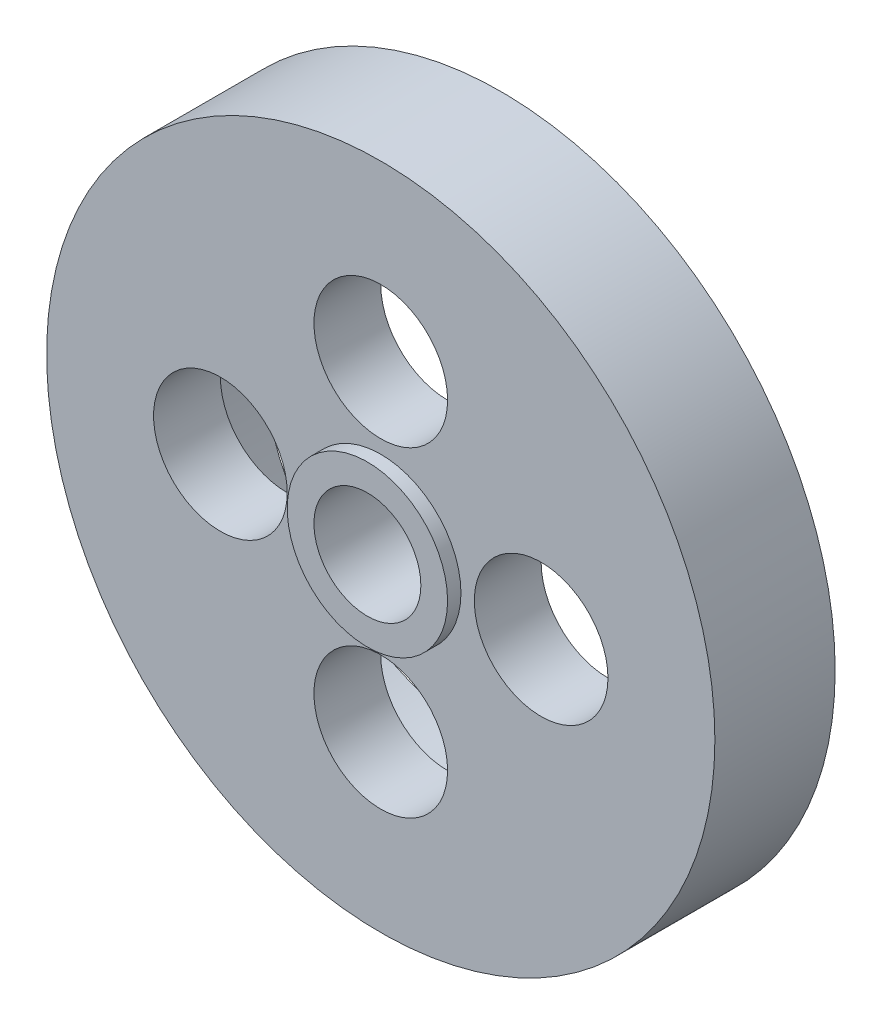
ISO-10303-21;
HEADER;
FILE_DESCRIPTION(('STEP AP214'),'2;1');
FILE_NAME('part.step','',(''),(''),'','','');
FILE_SCHEMA(('AUTOMOTIVE_DESIGN { 1 0 10303 214 1 1 1 1 }'));
ENDSEC;
DATA;
#1=APPLICATION_CONTEXT('core data for automotive mechanical design processes');
#2=APPLICATION_PROTOCOL_DEFINITION('international standard','automotive_design',2000,#1);
#3=PRODUCT_CONTEXT('',#1,'mechanical');
#4=PRODUCT('Part','Part','',(#3));
#5=PRODUCT_RELATED_PRODUCT_CATEGORY('part','',(#4));
#6=PRODUCT_DEFINITION_FORMATION('','',#4);
#7=PRODUCT_DEFINITION_CONTEXT('part definition',#1,'design');
#8=PRODUCT_DEFINITION('design','',#6,#7);
#9=PRODUCT_DEFINITION_SHAPE('','',#8);
#10=(LENGTH_UNIT() NAMED_UNIT(*) SI_UNIT(.MILLI.,.METRE.));
#11=(NAMED_UNIT(*) PLANE_ANGLE_UNIT() SI_UNIT($,.RADIAN.));
#12=(NAMED_UNIT(*) SI_UNIT($,.STERADIAN.) SOLID_ANGLE_UNIT());
#13=UNCERTAINTY_MEASURE_WITH_UNIT(LENGTH_MEASURE(1.E-05),#10,'distance_accuracy_value','');
#14=(GEOMETRIC_REPRESENTATION_CONTEXT(3) GLOBAL_UNCERTAINTY_ASSIGNED_CONTEXT((#13)) GLOBAL_UNIT_ASSIGNED_CONTEXT((#10,
#11,#12)) REPRESENTATION_CONTEXT('',''));
#15=CARTESIAN_POINT('',(0.,0.,0.));
#16=DIRECTION('',(0.,0.,1.));
#17=DIRECTION('',(1.,0.,0.));
#18=AXIS2_PLACEMENT_3D('',#15,#16,#17);
#19=CARTESIAN_POINT('',(0.,0.,9.));
#20=DIRECTION('',(0.,0.,-1.));
#21=DIRECTION('',(-1.,0.,0.));
#22=AXIS2_PLACEMENT_3D('',#19,#20,#21);
#23=CYLINDRICAL_SURFACE('',#22,25.);
#24=CARTESIAN_POINT('',(0.,0.,9.));
#25=DIRECTION('',(0.,0.,1.));
#26=DIRECTION('',(1.,0.,0.));
#27=AXIS2_PLACEMENT_3D('',#24,#25,#26);
#28=CIRCLE('',#27,25.);
#29=CARTESIAN_POINT('',(25.,0.,9.));
#30=VERTEX_POINT('',#29);
#31=EDGE_CURVE('E10',#30,#30,#28,.T.);
#32=ORIENTED_EDGE('',*,*,#31,.F.);
#33=EDGE_LOOP('',(#32));
#34=FACE_BOUND('',#33,.T.);
#35=CARTESIAN_POINT('',(0.,0.,0.));
#36=DIRECTION('',(0.,0.,1.));
#37=DIRECTION('',(1.,0.,0.));
#38=AXIS2_PLACEMENT_3D('',#35,#36,#37);
#39=CIRCLE('',#38,25.);
#40=CARTESIAN_POINT('',(25.,0.,0.));
#41=VERTEX_POINT('',#40);
#42=EDGE_CURVE('E49',#41,#41,#39,.T.);
#43=ORIENTED_EDGE('',*,*,#42,.T.);
#44=EDGE_LOOP('',(#43));
#45=FACE_BOUND('',#44,.T.);
#46=ADVANCED_FACE('F41',(#34,#45),#23,.T.);
#47=CARTESIAN_POINT('',(0.,0.,9.));
#48=DIRECTION('',(0.,0.,1.));
#49=DIRECTION('',(1.,0.,0.));
#50=AXIS2_PLACEMENT_3D('',#47,#48,#49);
#51=PLANE('',#50);
#52=CARTESIAN_POINT('',(0.,0.,9.));
#53=DIRECTION('',(0.,0.,1.));
#54=DIRECTION('',(1.,0.,0.));
#55=AXIS2_PLACEMENT_3D('',#52,#53,#54);
#56=CIRCLE('',#55,6.);
#57=CARTESIAN_POINT('',(6.,0.,9.));
#58=VERTEX_POINT('',#57);
#59=EDGE_CURVE('E103',#58,#58,#56,.T.);
#60=ORIENTED_EDGE('',*,*,#59,.F.);
#61=EDGE_LOOP('',(#60));
#62=FACE_BOUND('',#61,.T.);
#63=CARTESIAN_POINT('',(0.,12.,9.));
#64=DIRECTION('',(0.,0.,1.));
#65=DIRECTION('',(1.,0.,0.));
#66=AXIS2_PLACEMENT_3D('',#63,#64,#65);
#67=CIRCLE('',#66,5.);
#68=CARTESIAN_POINT('',(5.,12.,9.));
#69=VERTEX_POINT('',#68);
#70=EDGE_CURVE('E66',#69,#69,#67,.T.);
#71=ORIENTED_EDGE('',*,*,#70,.F.);
#72=EDGE_LOOP('',(#71));
#73=FACE_BOUND('',#72,.T.);
#74=CARTESIAN_POINT('',(12.,0.,9.));
#75=DIRECTION('',(0.,0.,1.));
#76=DIRECTION('',(1.,0.,0.));
#77=AXIS2_PLACEMENT_3D('',#74,#75,#76);
#78=CIRCLE('',#77,5.);
#79=CARTESIAN_POINT('',(17.,0.,9.));
#80=VERTEX_POINT('',#79);
#81=EDGE_CURVE('E96',#80,#80,#78,.T.);
#82=ORIENTED_EDGE('',*,*,#81,.F.);
#83=EDGE_LOOP('',(#82));
#84=FACE_BOUND('',#83,.T.);
#85=CARTESIAN_POINT('',(3.36651784687918E-13,-12.,9.));
#86=DIRECTION('',(0.,0.,1.));
#87=DIRECTION('',(1.,0.,0.));
#88=AXIS2_PLACEMENT_3D('',#85,#86,#87);
#89=CIRCLE('',#88,5.0000000000004);
#90=CARTESIAN_POINT('',(5.00000000000074,-12.,9.));
#91=VERTEX_POINT('',#90);
#92=EDGE_CURVE('E91',#91,#91,#89,.T.);
#93=ORIENTED_EDGE('',*,*,#92,.F.);
#94=EDGE_LOOP('',(#93));
#95=FACE_BOUND('',#94,.T.);
#96=CARTESIAN_POINT('',(-12.,0.,9.));
#97=DIRECTION('',(0.,0.,1.));
#98=DIRECTION('',(1.,0.,0.));
#99=AXIS2_PLACEMENT_3D('',#96,#97,#98);
#100=CIRCLE('',#99,5.00000000000012);
#101=CARTESIAN_POINT('',(-6.99999999999988,0.,9.));
#102=VERTEX_POINT('',#101);
#103=EDGE_CURVE('E87',#102,#102,#100,.T.);
#104=ORIENTED_EDGE('',*,*,#103,.F.);
#105=EDGE_LOOP('',(#104));
#106=FACE_BOUND('',#105,.T.);
#107=ORIENTED_EDGE('',*,*,#31,.T.);
#108=EDGE_LOOP('',(#107));
#109=FACE_BOUND('',#108,.T.);
#110=ADVANCED_FACE('F134',(#62,#73,#84,#95,#106,#109),#51,.T.);
#111=CARTESIAN_POINT('',(0.,0.,0.));
#112=DIRECTION('',(0.,0.,1.));
#113=DIRECTION('',(1.,0.,0.));
#114=AXIS2_PLACEMENT_3D('',#111,#112,#113);
#115=PLANE('',#114);
#116=CARTESIAN_POINT('',(0.,0.,0.));
#117=DIRECTION('',(0.,0.,-1.));
#118=DIRECTION('',(-1.,0.,0.));
#119=AXIS2_PLACEMENT_3D('',#116,#117,#118);
#120=CIRCLE('',#119,18.);
#121=CARTESIAN_POINT('',(-18.,0.,0.));
#122=VERTEX_POINT('',#121);
#123=EDGE_CURVE('E58',#122,#122,#120,.T.);
#124=ORIENTED_EDGE('',*,*,#123,.F.);
#125=EDGE_LOOP('',(#124));
#126=FACE_BOUND('',#125,.T.);
#127=ORIENTED_EDGE('',*,*,#42,.F.);
#128=EDGE_LOOP('',(#127));
#129=FACE_BOUND('',#128,.T.);
#130=ADVANCED_FACE('F137',(#126,#129),#115,.F.);
#131=CARTESIAN_POINT('',(0.,0.,4.));
#132=DIRECTION('',(0.,0.,-1.));
#133=DIRECTION('',(-1.,0.,0.));
#134=AXIS2_PLACEMENT_3D('',#131,#132,#133);
#135=CYLINDRICAL_SURFACE('',#134,18.);
#136=CARTESIAN_POINT('',(0.,0.,4.));
#137=DIRECTION('',(0.,0.,-1.));
#138=DIRECTION('',(-1.,0.,0.));
#139=AXIS2_PLACEMENT_3D('',#136,#137,#138);
#140=CIRCLE('',#139,18.);
#141=CARTESIAN_POINT('',(-18.,0.,4.));
#142=VERTEX_POINT('',#141);
#143=EDGE_CURVE('E55',#142,#142,#140,.T.);
#144=ORIENTED_EDGE('',*,*,#143,.F.);
#145=EDGE_LOOP('',(#144));
#146=FACE_BOUND('',#145,.T.);
#147=ORIENTED_EDGE('',*,*,#123,.T.);
#148=EDGE_LOOP('',(#147));
#149=FACE_BOUND('',#148,.T.);
#150=ADVANCED_FACE('F160',(#146,#149),#135,.F.);
#151=CARTESIAN_POINT('',(0.,0.,4.));
#152=DIRECTION('',(0.,0.,-1.));
#153=DIRECTION('',(-1.,0.,0.));
#154=AXIS2_PLACEMENT_3D('',#151,#152,#153);
#155=PLANE('',#154);
#156=CARTESIAN_POINT('',(0.,0.,4.));
#157=DIRECTION('',(0.,0.,-1.));
#158=DIRECTION('',(-1.,0.,0.));
#159=AXIS2_PLACEMENT_3D('',#156,#157,#158);
#160=CIRCLE('',#159,4.);
#161=CARTESIAN_POINT('',(-4.,0.,4.));
#162=VERTEX_POINT('',#161);
#163=EDGE_CURVE('E107',#162,#162,#160,.T.);
#164=ORIENTED_EDGE('',*,*,#163,.F.);
#165=EDGE_LOOP('',(#164));
#166=FACE_BOUND('',#165,.T.);
#167=CARTESIAN_POINT('',(0.,12.,4.));
#168=DIRECTION('',(0.,0.,-1.));
#169=DIRECTION('',(-1.,0.,0.));
#170=AXIS2_PLACEMENT_3D('',#167,#168,#169);
#171=CIRCLE('',#170,5.);
#172=CARTESIAN_POINT('',(-5.,12.,4.));
#173=VERTEX_POINT('',#172);
#174=EDGE_CURVE('E44',#173,#173,#171,.T.);
#175=ORIENTED_EDGE('',*,*,#174,.F.);
#176=EDGE_LOOP('',(#175));
#177=FACE_BOUND('',#176,.T.);
#178=CARTESIAN_POINT('',(12.,0.,4.));
#179=DIRECTION('',(0.,0.,-1.));
#180=DIRECTION('',(-1.,0.,0.));
#181=AXIS2_PLACEMENT_3D('',#178,#179,#180);
#182=CIRCLE('',#181,5.);
#183=CARTESIAN_POINT('',(7.,0.,4.));
#184=VERTEX_POINT('',#183);
#185=EDGE_CURVE('E69',#184,#184,#182,.T.);
#186=ORIENTED_EDGE('',*,*,#185,.F.);
#187=EDGE_LOOP('',(#186));
#188=FACE_BOUND('',#187,.T.);
#189=CARTESIAN_POINT('',(3.36651784687918E-13,-12.,4.));
#190=DIRECTION('',(0.,0.,-1.));
#191=DIRECTION('',(-1.,0.,0.));
#192=AXIS2_PLACEMENT_3D('',#189,#190,#191);
#193=CIRCLE('',#192,5.0000000000004);
#194=CARTESIAN_POINT('',(-5.00000000000007,-12.,4.));
#195=VERTEX_POINT('',#194);
#196=EDGE_CURVE('E65',#195,#195,#193,.T.);
#197=ORIENTED_EDGE('',*,*,#196,.F.);
#198=EDGE_LOOP('',(#197));
#199=FACE_BOUND('',#198,.T.);
#200=CARTESIAN_POINT('',(-12.,0.,4.));
#201=DIRECTION('',(0.,0.,-1.));
#202=DIRECTION('',(-1.,0.,0.));
#203=AXIS2_PLACEMENT_3D('',#200,#201,#202);
#204=CIRCLE('',#203,5.00000000000012);
#205=CARTESIAN_POINT('',(-17.0000000000001,0.,4.));
#206=VERTEX_POINT('',#205);
#207=EDGE_CURVE('E61',#206,#206,#204,.T.);
#208=ORIENTED_EDGE('',*,*,#207,.F.);
#209=EDGE_LOOP('',(#208));
#210=FACE_BOUND('',#209,.T.);
#211=ORIENTED_EDGE('',*,*,#143,.T.);
#212=EDGE_LOOP('',(#211));
#213=FACE_BOUND('',#212,.T.);
#214=ADVANCED_FACE('F150',(#166,#177,#188,#199,#210,#213),#155,.T.);
#215=CARTESIAN_POINT('',(-12.,0.,0.));
#216=DIRECTION('',(0.,0.,1.));
#217=DIRECTION('',(1.,0.,0.));
#218=AXIS2_PLACEMENT_3D('',#215,#216,#217);
#219=CYLINDRICAL_SURFACE('',#218,5.00000000000012);
#220=ORIENTED_EDGE('',*,*,#207,.T.);
#221=EDGE_LOOP('',(#220));
#222=FACE_BOUND('',#221,.T.);
#223=ORIENTED_EDGE('',*,*,#103,.T.);
#224=EDGE_LOOP('',(#223));
#225=FACE_BOUND('',#224,.T.);
#226=ADVANCED_FACE('F147',(#222,#225),#219,.F.);
#227=CARTESIAN_POINT('',(3.36651784687918E-13,-12.,0.));
#228=DIRECTION('',(0.,0.,1.));
#229=DIRECTION('',(1.,0.,0.));
#230=AXIS2_PLACEMENT_3D('',#227,#228,#229);
#231=CYLINDRICAL_SURFACE('',#230,5.0000000000004);
#232=ORIENTED_EDGE('',*,*,#196,.T.);
#233=EDGE_LOOP('',(#232));
#234=FACE_BOUND('',#233,.T.);
#235=ORIENTED_EDGE('',*,*,#92,.T.);
#236=EDGE_LOOP('',(#235));
#237=FACE_BOUND('',#236,.T.);
#238=ADVANCED_FACE('F149',(#234,#237),#231,.F.);
#239=CARTESIAN_POINT('',(12.,0.,0.));
#240=DIRECTION('',(0.,0.,1.));
#241=DIRECTION('',(1.,0.,0.));
#242=AXIS2_PLACEMENT_3D('',#239,#240,#241);
#243=CYLINDRICAL_SURFACE('',#242,5.);
#244=ORIENTED_EDGE('',*,*,#185,.T.);
#245=EDGE_LOOP('',(#244));
#246=FACE_BOUND('',#245,.T.);
#247=ORIENTED_EDGE('',*,*,#81,.T.);
#248=EDGE_LOOP('',(#247));
#249=FACE_BOUND('',#248,.T.);
#250=ADVANCED_FACE('F157',(#246,#249),#243,.F.);
#251=CARTESIAN_POINT('',(0.,12.,0.));
#252=DIRECTION('',(0.,0.,1.));
#253=DIRECTION('',(1.,0.,0.));
#254=AXIS2_PLACEMENT_3D('',#251,#252,#253);
#255=CYLINDRICAL_SURFACE('',#254,5.);
#256=ORIENTED_EDGE('',*,*,#174,.T.);
#257=EDGE_LOOP('',(#256));
#258=FACE_BOUND('',#257,.T.);
#259=ORIENTED_EDGE('',*,*,#70,.T.);
#260=EDGE_LOOP('',(#259));
#261=FACE_BOUND('',#260,.T.);
#262=ADVANCED_FACE('F130',(#258,#261),#255,.F.);
#263=CARTESIAN_POINT('',(0.,0.,10.));
#264=DIRECTION('',(0.,0.,-1.));
#265=DIRECTION('',(-1.,0.,0.));
#266=AXIS2_PLACEMENT_3D('',#263,#264,#265);
#267=CYLINDRICAL_SURFACE('',#266,6.);
#268=CARTESIAN_POINT('',(0.,0.,10.));
#269=DIRECTION('',(0.,0.,1.));
#270=DIRECTION('',(1.,0.,0.));
#271=AXIS2_PLACEMENT_3D('',#268,#269,#270);
#272=CIRCLE('',#271,6.);
#273=CARTESIAN_POINT('',(6.,0.,10.));
#274=VERTEX_POINT('',#273);
#275=EDGE_CURVE('E92',#274,#274,#272,.T.);
#276=ORIENTED_EDGE('',*,*,#275,.F.);
#277=EDGE_LOOP('',(#276));
#278=FACE_BOUND('',#277,.T.);
#279=ORIENTED_EDGE('',*,*,#59,.T.);
#280=EDGE_LOOP('',(#279));
#281=FACE_BOUND('',#280,.T.);
#282=ADVANCED_FACE('F124',(#278,#281),#267,.T.);
#283=CARTESIAN_POINT('',(0.,0.,10.));
#284=DIRECTION('',(0.,0.,1.));
#285=DIRECTION('',(1.,0.,0.));
#286=AXIS2_PLACEMENT_3D('',#283,#284,#285);
#287=PLANE('',#286);
#288=CARTESIAN_POINT('',(0.,0.,10.));
#289=DIRECTION('',(0.,0.,1.));
#290=DIRECTION('',(1.,0.,0.));
#291=AXIS2_PLACEMENT_3D('',#288,#289,#290);
#292=CIRCLE('',#291,4.);
#293=CARTESIAN_POINT('',(4.,0.,10.));
#294=VERTEX_POINT('',#293);
#295=EDGE_CURVE('E114',#294,#294,#292,.T.);
#296=ORIENTED_EDGE('',*,*,#295,.F.);
#297=EDGE_LOOP('',(#296));
#298=FACE_BOUND('',#297,.T.);
#299=ORIENTED_EDGE('',*,*,#275,.T.);
#300=EDGE_LOOP('',(#299));
#301=FACE_BOUND('',#300,.T.);
#302=ADVANCED_FACE('F121',(#298,#301),#287,.T.);
#303=CARTESIAN_POINT('',(0.,0.,0.));
#304=DIRECTION('',(0.,0.,1.));
#305=DIRECTION('',(1.,0.,0.));
#306=AXIS2_PLACEMENT_3D('',#303,#304,#305);
#307=CYLINDRICAL_SURFACE('',#306,4.);
#308=ORIENTED_EDGE('',*,*,#163,.T.);
#309=EDGE_LOOP('',(#308));
#310=FACE_BOUND('',#309,.T.);
#311=ORIENTED_EDGE('',*,*,#295,.T.);
#312=EDGE_LOOP('',(#311));
#313=FACE_BOUND('',#312,.T.);
#314=ADVANCED_FACE('F119',(#310,#313),#307,.F.);
#315=CLOSED_SHELL('',(#46,#110,#130,#150,#214,#226,#238,#250,#262,#282,#302,#314));
#316=MANIFOLD_SOLID_BREP('B2',#315);
#317=ADVANCED_BREP_SHAPE_REPRESENTATION('',(#18,#316),#14);
#318=SHAPE_DEFINITION_REPRESENTATION(#9,#317);
ENDSEC;
END-ISO-10303-21;
